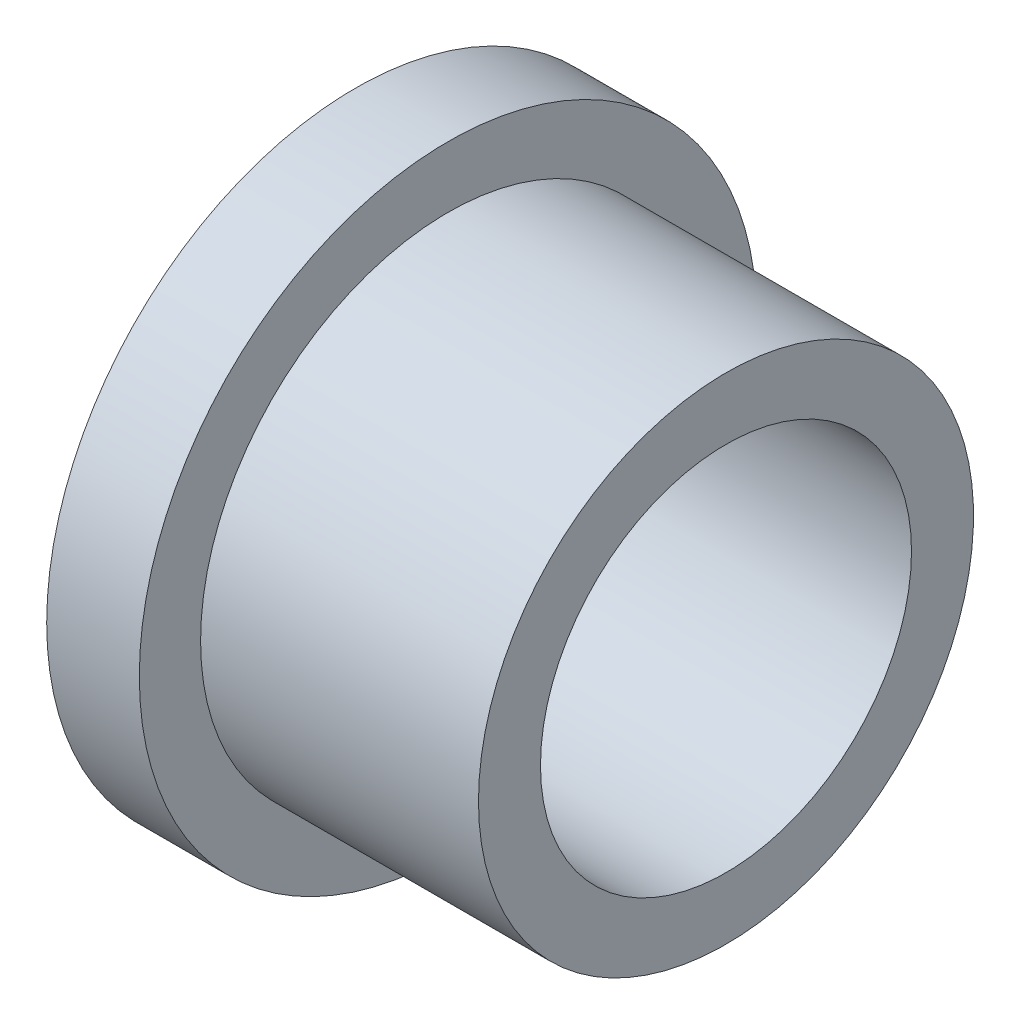
ISO-10303-21;
HEADER;
FILE_DESCRIPTION(('STEP AP214'),'2;1');
FILE_NAME('part.step','',(''),(''),'','','');
FILE_SCHEMA(('AUTOMOTIVE_DESIGN { 1 0 10303 214 1 1 1 1 }'));
ENDSEC;
DATA;
#1=APPLICATION_CONTEXT('core data for automotive mechanical design processes');
#2=APPLICATION_PROTOCOL_DEFINITION('international standard','automotive_design',2000,#1);
#3=PRODUCT_CONTEXT('',#1,'mechanical');
#4=PRODUCT('Part','Part','',(#3));
#5=PRODUCT_RELATED_PRODUCT_CATEGORY('part','',(#4));
#6=PRODUCT_DEFINITION_FORMATION('','',#4);
#7=PRODUCT_DEFINITION_CONTEXT('part definition',#1,'design');
#8=PRODUCT_DEFINITION('design','',#6,#7);
#9=PRODUCT_DEFINITION_SHAPE('','',#8);
#10=(LENGTH_UNIT() NAMED_UNIT(*) SI_UNIT(.MILLI.,.METRE.));
#11=(NAMED_UNIT(*) PLANE_ANGLE_UNIT() SI_UNIT($,.RADIAN.));
#12=(NAMED_UNIT(*) SI_UNIT($,.STERADIAN.) SOLID_ANGLE_UNIT());
#13=UNCERTAINTY_MEASURE_WITH_UNIT(LENGTH_MEASURE(1.E-05),#10,'distance_accuracy_value','');
#14=(GEOMETRIC_REPRESENTATION_CONTEXT(3) GLOBAL_UNCERTAINTY_ASSIGNED_CONTEXT((#13)) GLOBAL_UNIT_ASSIGNED_CONTEXT((#10,
#11,#12)) REPRESENTATION_CONTEXT('',''));
#15=CARTESIAN_POINT('',(0.,0.,0.));
#16=DIRECTION('',(0.,0.,1.));
#17=DIRECTION('',(1.,0.,0.));
#18=AXIS2_PLACEMENT_3D('',#15,#16,#17);
#19=CARTESIAN_POINT('',(4.7625,0.,0.));
#20=DIRECTION('',(1.,0.,0.));
#21=DIRECTION('',(0.,0.,-1.));
#22=AXIS2_PLACEMENT_3D('',#19,#20,#21);
#23=PLANE('',#22);
#24=CARTESIAN_POINT('',(4.7625,0.,0.));
#25=DIRECTION('',(1.,0.,0.));
#26=DIRECTION('',(0.,0.,-1.));
#27=AXIS2_PLACEMENT_3D('',#24,#25,#26);
#28=CIRCLE('',#27,15.875);
#29=CARTESIAN_POINT('',(4.7625,0.,15.875));
#30=VERTEX_POINT('',#29);
#31=EDGE_CURVE('E11',#30,#30,#28,.T.);
#32=ORIENTED_EDGE('',*,*,#31,.T.);
#33=EDGE_LOOP('',(#32));
#34=FACE_BOUND('',#33,.T.);
#35=CARTESIAN_POINT('',(4.7625,0.,0.));
#36=DIRECTION('',(1.,0.,0.));
#37=DIRECTION('',(0.,0.,-1.));
#38=AXIS2_PLACEMENT_3D('',#35,#36,#37);
#39=CIRCLE('',#38,12.7254);
#40=CARTESIAN_POINT('',(4.7625,0.,12.7254));
#41=VERTEX_POINT('',#40);
#42=EDGE_CURVE('E66',#41,#41,#39,.F.);
#43=ORIENTED_EDGE('',*,*,#42,.T.);
#44=EDGE_LOOP('',(#43));
#45=FACE_BOUND('',#44,.T.);
#46=ADVANCED_FACE('F51',(#34,#45),#23,.T.);
#47=CARTESIAN_POINT('',(0.,0.,0.));
#48=DIRECTION('',(1.,0.,0.));
#49=DIRECTION('',(0.,0.,-1.));
#50=AXIS2_PLACEMENT_3D('',#47,#48,#49);
#51=PLANE('',#50);
#52=CARTESIAN_POINT('',(0.,0.,0.));
#53=DIRECTION('',(1.,0.,0.));
#54=DIRECTION('',(0.,0.,-1.));
#55=AXIS2_PLACEMENT_3D('',#52,#53,#54);
#56=CIRCLE('',#55,9.5377);
#57=CARTESIAN_POINT('',(0.,0.,9.5377));
#58=VERTEX_POINT('',#57);
#59=EDGE_CURVE('E62',#58,#58,#56,.T.);
#60=ORIENTED_EDGE('',*,*,#59,.T.);
#61=EDGE_LOOP('',(#60));
#62=FACE_BOUND('',#61,.T.);
#63=CARTESIAN_POINT('',(0.,0.,0.));
#64=DIRECTION('',(1.,0.,0.));
#65=DIRECTION('',(0.,0.,-1.));
#66=AXIS2_PLACEMENT_3D('',#63,#64,#65);
#67=CIRCLE('',#66,15.875);
#68=CARTESIAN_POINT('',(0.,0.,15.875));
#69=VERTEX_POINT('',#68);
#70=EDGE_CURVE('E55',#69,#69,#67,.T.);
#71=ORIENTED_EDGE('',*,*,#70,.F.);
#72=EDGE_LOOP('',(#71));
#73=FACE_BOUND('',#72,.T.);
#74=ADVANCED_FACE('F92',(#62,#73),#51,.F.);
#75=CARTESIAN_POINT('',(4.7625,0.,0.));
#76=DIRECTION('',(-1.,0.,0.));
#77=DIRECTION('',(0.,0.,1.));
#78=AXIS2_PLACEMENT_3D('',#75,#76,#77);
#79=CYLINDRICAL_SURFACE('',#78,15.875);
#80=CARTESIAN_POINT('',(4.7625,0.,15.875));
#81=CARTESIAN_POINT('',(4.712890625,0.,15.875));
#82=CARTESIAN_POINT('',(4.66328125,0.,15.875));
#83=CARTESIAN_POINT('',(4.5640625,0.,15.875));
#84=CARTESIAN_POINT('',(4.514453125,0.,15.875));
#85=CARTESIAN_POINT('',(4.415234375,0.,15.875));
#86=CARTESIAN_POINT('',(4.365625,0.,15.875));
#87=CARTESIAN_POINT('',(4.26640625,0.,15.875));
#88=CARTESIAN_POINT('',(4.216796875,0.,15.875));
#89=CARTESIAN_POINT('',(4.117578125,0.,15.875));
#90=CARTESIAN_POINT('',(4.06796875,0.,15.875));
#91=CARTESIAN_POINT('',(3.96875,0.,15.875));
#92=CARTESIAN_POINT('',(3.919140625,0.,15.875));
#93=CARTESIAN_POINT('',(3.819921875,0.,15.875));
#94=CARTESIAN_POINT('',(3.7703125,0.,15.875));
#95=CARTESIAN_POINT('',(3.67109375,0.,15.875));
#96=CARTESIAN_POINT('',(3.621484375,0.,15.875));
#97=CARTESIAN_POINT('',(3.522265625,0.,15.875));
#98=CARTESIAN_POINT('',(3.47265625,0.,15.875));
#99=CARTESIAN_POINT('',(3.3734375,0.,15.875));
#100=CARTESIAN_POINT('',(3.323828125,0.,15.875));
#101=CARTESIAN_POINT('',(3.224609375,0.,15.875));
#102=CARTESIAN_POINT('',(3.175,0.,15.875));
#103=CARTESIAN_POINT('',(3.07578125,0.,15.875));
#104=CARTESIAN_POINT('',(3.026171875,0.,15.875));
#105=CARTESIAN_POINT('',(2.926953125,0.,15.875));
#106=CARTESIAN_POINT('',(2.87734375,0.,15.875));
#107=CARTESIAN_POINT('',(2.778125,0.,15.875));
#108=CARTESIAN_POINT('',(2.728515625,0.,15.875));
#109=CARTESIAN_POINT('',(2.629296875,0.,15.875));
#110=CARTESIAN_POINT('',(2.5796875,0.,15.875));
#111=CARTESIAN_POINT('',(2.48046875,0.,15.875));
#112=CARTESIAN_POINT('',(2.430859375,0.,15.875));
#113=CARTESIAN_POINT('',(2.331640625,0.,15.875));
#114=CARTESIAN_POINT('',(2.28203125,0.,15.875));
#115=CARTESIAN_POINT('',(2.1828125,0.,15.875));
#116=CARTESIAN_POINT('',(2.133203125,0.,15.875));
#117=CARTESIAN_POINT('',(2.033984375,0.,15.875));
#118=CARTESIAN_POINT('',(1.984375,0.,15.875));
#119=CARTESIAN_POINT('',(1.88515625,0.,15.875));
#120=CARTESIAN_POINT('',(1.835546875,0.,15.875));
#121=CARTESIAN_POINT('',(1.736328125,0.,15.875));
#122=CARTESIAN_POINT('',(1.68671875,0.,15.875));
#123=CARTESIAN_POINT('',(1.5875,0.,15.875));
#124=CARTESIAN_POINT('',(1.537890625,0.,15.875));
#125=CARTESIAN_POINT('',(1.438671875,0.,15.875));
#126=CARTESIAN_POINT('',(1.3890625,0.,15.875));
#127=CARTESIAN_POINT('',(1.28984375,0.,15.875));
#128=CARTESIAN_POINT('',(1.240234375,0.,15.875));
#129=CARTESIAN_POINT('',(1.141015625,0.,15.875));
#130=CARTESIAN_POINT('',(1.09140625,0.,15.875));
#131=CARTESIAN_POINT('',(0.992187499999999,0.,15.875));
#132=CARTESIAN_POINT('',(0.942578124999999,0.,15.875));
#133=CARTESIAN_POINT('',(0.843359375,0.,15.875));
#134=CARTESIAN_POINT('',(0.79375,0.,15.875));
#135=CARTESIAN_POINT('',(0.69453125,0.,15.875));
#136=CARTESIAN_POINT('',(0.644921875,0.,15.875));
#137=CARTESIAN_POINT('',(0.545703125,0.,15.875));
#138=CARTESIAN_POINT('',(0.49609375,0.,15.875));
#139=CARTESIAN_POINT('',(0.396875,0.,15.875));
#140=CARTESIAN_POINT('',(0.347265625,0.,15.875));
#141=CARTESIAN_POINT('',(0.248046875,0.,15.875));
#142=CARTESIAN_POINT('',(0.1984375,0.,15.875));
#143=CARTESIAN_POINT('',(0.09921875,0.,15.875));
#144=CARTESIAN_POINT('',(0.049609375,0.,15.875));
#145=CARTESIAN_POINT('',(0.,0.,15.875));
#146=B_SPLINE_CURVE_WITH_KNOTS('',3,(#80,#81,#82,#83,#84,#85,#86,#87,#88,#89,#90,#91,#92,#93,
#94,#95,#96,#97,#98,#99,#100,#101,#102,#103,#104,#105,#106,#107,#108,#109,#110,#111,#112,#113,
#114,#115,#116,#117,#118,#119,#120,#121,#122,#123,#124,#125,#126,#127,#128,#129,#130,#131,#132,
#133,#134,#135,#136,#137,#138,#139,#140,#141,#142,#143,#144,#145),.UNSPECIFIED.,.F.,.F.,(4,2,2,
2,2,2,2,2,2,2,2,2,2,2,2,2,2,2,2,2,2,2,2,2,2,2,2,2,2,2,2,2,4),(0.,0.148828125,0.29765625,
0.446484375,0.5953125,0.744140625,0.892968750000001,1.041796875,1.190625,1.339453125,1.48828125,
1.637109375,1.7859375,1.934765625,2.08359375,2.232421875,2.38125,2.530078125,2.67890625,
2.827734375,2.9765625,3.125390625,3.27421875,3.423046875,3.571875,3.720703125,3.86953125,
4.018359375,4.1671875,4.316015625,4.46484375,4.613671875,4.7625),.UNSPECIFIED.);
#147=EDGE_CURVE('BSEAM53',#30,#69,#146,.T.);
#148=ORIENTED_EDGE('',*,*,#31,.F.);
#149=ORIENTED_EDGE('',*,*,#70,.T.);
#150=ORIENTED_EDGE('',*,*,#147,.T.);
#151=ORIENTED_EDGE('',*,*,#147,.F.);
#152=EDGE_LOOP('',(#148,#150,#149,#151));
#153=FACE_BOUND('',#152,.T.);
#154=ADVANCED_FACE('F53',(#153),#79,.T.);
#155=CARTESIAN_POINT('',(4.7625,0.,0.));
#156=DIRECTION('',(-1.,0.,0.));
#157=DIRECTION('',(0.,0.,1.));
#158=AXIS2_PLACEMENT_3D('',#155,#156,#157);
#159=CYLINDRICAL_SURFACE('',#158,9.5377);
#160=CARTESIAN_POINT('',(19.05,0.,0.));
#161=DIRECTION('',(1.,0.,0.));
#162=DIRECTION('',(0.,0.,-1.));
#163=AXIS2_PLACEMENT_3D('',#160,#161,#162);
#164=CIRCLE('',#163,9.5377);
#165=CARTESIAN_POINT('',(19.05,0.,9.5377));
#166=VERTEX_POINT('',#165);
#167=EDGE_CURVE('E72',#166,#166,#164,.T.);
#168=CARTESIAN_POINT('',(0.,0.,9.5377));
#169=CARTESIAN_POINT('',(0.1984375,0.,9.5377));
#170=CARTESIAN_POINT('',(0.396875,0.,9.5377));
#171=CARTESIAN_POINT('',(0.79375,0.,9.5377));
#172=CARTESIAN_POINT('',(0.9921875,0.,9.5377));
#173=CARTESIAN_POINT('',(1.3890625,0.,9.5377));
#174=CARTESIAN_POINT('',(1.5875,0.,9.5377));
#175=CARTESIAN_POINT('',(1.984375,0.,9.5377));
#176=CARTESIAN_POINT('',(2.1828125,0.,9.5377));
#177=CARTESIAN_POINT('',(2.5796875,0.,9.5377));
#178=CARTESIAN_POINT('',(2.778125,0.,9.5377));
#179=CARTESIAN_POINT('',(3.175,0.,9.5377));
#180=CARTESIAN_POINT('',(3.3734375,0.,9.5377));
#181=CARTESIAN_POINT('',(3.7703125,0.,9.5377));
#182=CARTESIAN_POINT('',(3.96875,0.,9.5377));
#183=CARTESIAN_POINT('',(4.365625,0.,9.5377));
#184=CARTESIAN_POINT('',(4.5640625,0.,9.5377));
#185=CARTESIAN_POINT('',(4.9609375,0.,9.5377));
#186=CARTESIAN_POINT('',(5.159375,0.,9.5377));
#187=CARTESIAN_POINT('',(5.55625,0.,9.5377));
#188=CARTESIAN_POINT('',(5.7546875,0.,9.5377));
#189=CARTESIAN_POINT('',(6.1515625,0.,9.5377));
#190=CARTESIAN_POINT('',(6.35,0.,9.5377));
#191=CARTESIAN_POINT('',(6.746875,0.,9.5377));
#192=CARTESIAN_POINT('',(6.9453125,0.,9.5377));
#193=CARTESIAN_POINT('',(7.3421875,0.,9.5377));
#194=CARTESIAN_POINT('',(7.540625,0.,9.5377));
#195=CARTESIAN_POINT('',(7.9375,0.,9.5377));
#196=CARTESIAN_POINT('',(8.1359375,0.,9.5377));
#197=CARTESIAN_POINT('',(8.5328125,0.,9.5377));
#198=CARTESIAN_POINT('',(8.73125,0.,9.5377));
#199=CARTESIAN_POINT('',(9.128125,0.,9.5377));
#200=CARTESIAN_POINT('',(9.3265625,0.,9.5377));
#201=CARTESIAN_POINT('',(9.7234375,0.,9.5377));
#202=CARTESIAN_POINT('',(9.921875,0.,9.5377));
#203=CARTESIAN_POINT('',(10.31875,0.,9.5377));
#204=CARTESIAN_POINT('',(10.5171875,0.,9.5377));
#205=CARTESIAN_POINT('',(10.9140625,0.,9.5377));
#206=CARTESIAN_POINT('',(11.1125,0.,9.5377));
#207=CARTESIAN_POINT('',(11.509375,0.,9.5377));
#208=CARTESIAN_POINT('',(11.7078125,0.,9.5377));
#209=CARTESIAN_POINT('',(12.1046875,0.,9.5377));
#210=CARTESIAN_POINT('',(12.303125,0.,9.5377));
#211=CARTESIAN_POINT('',(12.7,0.,9.5377));
#212=CARTESIAN_POINT('',(12.8984375,0.,9.5377));
#213=CARTESIAN_POINT('',(13.2953125,0.,9.5377));
#214=CARTESIAN_POINT('',(13.49375,0.,9.5377));
#215=CARTESIAN_POINT('',(13.890625,0.,9.5377));
#216=CARTESIAN_POINT('',(14.0890625,0.,9.5377));
#217=CARTESIAN_POINT('',(14.4859375,0.,9.5377));
#218=CARTESIAN_POINT('',(14.684375,0.,9.5377));
#219=CARTESIAN_POINT('',(15.08125,0.,9.5377));
#220=CARTESIAN_POINT('',(15.2796875,0.,9.5377));
#221=CARTESIAN_POINT('',(15.6765625,0.,9.5377));
#222=CARTESIAN_POINT('',(15.875,0.,9.5377));
#223=CARTESIAN_POINT('',(16.271875,0.,9.5377));
#224=CARTESIAN_POINT('',(16.4703125,0.,9.5377));
#225=CARTESIAN_POINT('',(16.8671875,0.,9.5377));
#226=CARTESIAN_POINT('',(17.065625,0.,9.5377));
#227=CARTESIAN_POINT('',(17.4625,0.,9.5377));
#228=CARTESIAN_POINT('',(17.6609375,0.,9.5377));
#229=CARTESIAN_POINT('',(18.0578125,0.,9.5377));
#230=CARTESIAN_POINT('',(18.25625,0.,9.5377));
#231=CARTESIAN_POINT('',(18.653125,0.,9.5377));
#232=CARTESIAN_POINT('',(18.8515625,0.,9.5377));
#233=CARTESIAN_POINT('',(19.05,0.,9.5377));
#234=B_SPLINE_CURVE_WITH_KNOTS('',3,(#168,#169,#170,#171,#172,#173,#174,#175,#176,#177,#178,
#179,#180,#181,#182,#183,#184,#185,#186,#187,#188,#189,#190,#191,#192,#193,#194,#195,#196,#197,
#198,#199,#200,#201,#202,#203,#204,#205,#206,#207,#208,#209,#210,#211,#212,#213,#214,#215,#216,
#217,#218,#219,#220,#221,#222,#223,#224,#225,#226,#227,#228,#229,#230,#231,#232,#233),
.UNSPECIFIED.,.F.,.F.,(4,2,2,2,2,2,2,2,2,2,2,2,2,2,2,2,2,2,2,2,2,2,2,2,2,2,2,2,2,2,2,2,4),(0.,
0.5953125,1.190625,1.7859375,2.38125,2.9765625,3.571875,4.1671875,4.7625,5.3578125,5.953125,
6.5484375,7.14375,7.7390625,8.334375,8.9296875,9.525,10.1203125,10.715625,11.3109375,11.90625,
12.5015625,13.096875,13.6921875,14.2875,14.8828125,15.478125,16.0734375,16.66875,17.2640625,
17.859375,18.4546875,19.05),.UNSPECIFIED.);
#235=EDGE_CURVE('BSEAM76',#58,#166,#234,.T.);
#236=ORIENTED_EDGE('',*,*,#59,.F.);
#237=ORIENTED_EDGE('',*,*,#167,.T.);
#238=ORIENTED_EDGE('',*,*,#235,.T.);
#239=ORIENTED_EDGE('',*,*,#235,.F.);
#240=EDGE_LOOP('',(#236,#238,#237,#239));
#241=FACE_BOUND('',#240,.T.);
#242=ADVANCED_FACE('F76',(#241),#159,.F.);
#243=CARTESIAN_POINT('',(19.05,0.,0.));
#244=DIRECTION('',(1.,0.,0.));
#245=DIRECTION('',(0.,0.,-1.));
#246=AXIS2_PLACEMENT_3D('',#243,#244,#245);
#247=PLANE('',#246);
#248=CARTESIAN_POINT('',(19.05,0.,0.));
#249=DIRECTION('',(1.,0.,0.));
#250=DIRECTION('',(0.,0.,-1.));
#251=AXIS2_PLACEMENT_3D('',#248,#249,#250);
#252=CIRCLE('',#251,12.7254);
#253=CARTESIAN_POINT('',(19.05,0.,12.7254));
#254=VERTEX_POINT('',#253);
#255=EDGE_CURVE('E69',#254,#254,#252,.T.);
#256=ORIENTED_EDGE('',*,*,#255,.T.);
#257=EDGE_LOOP('',(#256));
#258=FACE_BOUND('',#257,.T.);
#259=ORIENTED_EDGE('',*,*,#167,.F.);
#260=EDGE_LOOP('',(#259));
#261=FACE_BOUND('',#260,.T.);
#262=ADVANCED_FACE('F78',(#258,#261),#247,.T.);
#263=CARTESIAN_POINT('',(19.05,0.,0.));
#264=DIRECTION('',(-1.,0.,0.));
#265=DIRECTION('',(0.,0.,1.));
#266=AXIS2_PLACEMENT_3D('',#263,#264,#265);
#267=CYLINDRICAL_SURFACE('',#266,12.7254);
#268=CARTESIAN_POINT('',(4.7625,0.,12.7254));
#269=CARTESIAN_POINT('',(4.911328125,0.,12.7254));
#270=CARTESIAN_POINT('',(5.06015625,0.,12.7254));
#271=CARTESIAN_POINT('',(5.3578125,0.,12.7254));
#272=CARTESIAN_POINT('',(5.506640625,0.,12.7254));
#273=CARTESIAN_POINT('',(5.804296875,0.,12.7254));
#274=CARTESIAN_POINT('',(5.953125,0.,12.7254));
#275=CARTESIAN_POINT('',(6.25078125,0.,12.7254));
#276=CARTESIAN_POINT('',(6.399609375,0.,12.7254));
#277=CARTESIAN_POINT('',(6.697265625,0.,12.7254));
#278=CARTESIAN_POINT('',(6.84609375,0.,12.7254));
#279=CARTESIAN_POINT('',(7.14375,0.,12.7254));
#280=CARTESIAN_POINT('',(7.292578125,0.,12.7254));
#281=CARTESIAN_POINT('',(7.590234375,0.,12.7254));
#282=CARTESIAN_POINT('',(7.7390625,0.,12.7254));
#283=CARTESIAN_POINT('',(8.03671875,0.,12.7254));
#284=CARTESIAN_POINT('',(8.185546875,0.,12.7254));
#285=CARTESIAN_POINT('',(8.483203125,0.,12.7254));
#286=CARTESIAN_POINT('',(8.63203125,0.,12.7254));
#287=CARTESIAN_POINT('',(8.9296875,0.,12.7254));
#288=CARTESIAN_POINT('',(9.078515625,0.,12.7254));
#289=CARTESIAN_POINT('',(9.376171875,0.,12.7254));
#290=CARTESIAN_POINT('',(9.525,0.,12.7254));
#291=CARTESIAN_POINT('',(9.82265625,0.,12.7254));
#292=CARTESIAN_POINT('',(9.971484375,0.,12.7254));
#293=CARTESIAN_POINT('',(10.269140625,0.,12.7254));
#294=CARTESIAN_POINT('',(10.41796875,0.,12.7254));
#295=CARTESIAN_POINT('',(10.715625,0.,12.7254));
#296=CARTESIAN_POINT('',(10.864453125,0.,12.7254));
#297=CARTESIAN_POINT('',(11.162109375,0.,12.7254));
#298=CARTESIAN_POINT('',(11.3109375,0.,12.7254));
#299=CARTESIAN_POINT('',(11.60859375,0.,12.7254));
#300=CARTESIAN_POINT('',(11.757421875,0.,12.7254));
#301=CARTESIAN_POINT('',(12.055078125,0.,12.7254));
#302=CARTESIAN_POINT('',(12.20390625,0.,12.7254));
#303=CARTESIAN_POINT('',(12.5015625,0.,12.7254));
#304=CARTESIAN_POINT('',(12.650390625,0.,12.7254));
#305=CARTESIAN_POINT('',(12.948046875,0.,12.7254));
#306=CARTESIAN_POINT('',(13.096875,0.,12.7254));
#307=CARTESIAN_POINT('',(13.39453125,0.,12.7254));
#308=CARTESIAN_POINT('',(13.543359375,0.,12.7254));
#309=CARTESIAN_POINT('',(13.841015625,0.,12.7254));
#310=CARTESIAN_POINT('',(13.98984375,0.,12.7254));
#311=CARTESIAN_POINT('',(14.2875,0.,12.7254));
#312=CARTESIAN_POINT('',(14.436328125,0.,12.7254));
#313=CARTESIAN_POINT('',(14.733984375,0.,12.7254));
#314=CARTESIAN_POINT('',(14.8828125,0.,12.7254));
#315=CARTESIAN_POINT('',(15.18046875,0.,12.7254));
#316=CARTESIAN_POINT('',(15.329296875,0.,12.7254));
#317=CARTESIAN_POINT('',(15.626953125,0.,12.7254));
#318=CARTESIAN_POINT('',(15.77578125,0.,12.7254));
#319=CARTESIAN_POINT('',(16.0734375,0.,12.7254));
#320=CARTESIAN_POINT('',(16.222265625,0.,12.7254));
#321=CARTESIAN_POINT('',(16.519921875,0.,12.7254));
#322=CARTESIAN_POINT('',(16.66875,0.,12.7254));
#323=CARTESIAN_POINT('',(16.96640625,0.,12.7254));
#324=CARTESIAN_POINT('',(17.115234375,0.,12.7254));
#325=CARTESIAN_POINT('',(17.412890625,0.,12.7254));
#326=CARTESIAN_POINT('',(17.56171875,0.,12.7254));
#327=CARTESIAN_POINT('',(17.859375,0.,12.7254));
#328=CARTESIAN_POINT('',(18.008203125,0.,12.7254));
#329=CARTESIAN_POINT('',(18.305859375,0.,12.7254));
#330=CARTESIAN_POINT('',(18.4546875,0.,12.7254));
#331=CARTESIAN_POINT('',(18.75234375,0.,12.7254));
#332=CARTESIAN_POINT('',(18.901171875,0.,12.7254));
#333=CARTESIAN_POINT('',(19.05,0.,12.7254));
#334=B_SPLINE_CURVE_WITH_KNOTS('',3,(#268,#269,#270,#271,#272,#273,#274,#275,#276,#277,#278,
#279,#280,#281,#282,#283,#284,#285,#286,#287,#288,#289,#290,#291,#292,#293,#294,#295,#296,#297,
#298,#299,#300,#301,#302,#303,#304,#305,#306,#307,#308,#309,#310,#311,#312,#313,#314,#315,#316,
#317,#318,#319,#320,#321,#322,#323,#324,#325,#326,#327,#328,#329,#330,#331,#332,#333),
.UNSPECIFIED.,.F.,.F.,(4,2,2,2,2,2,2,2,2,2,2,2,2,2,2,2,2,2,2,2,2,2,2,2,2,2,2,2,2,2,2,2,4),(0.,
0.446484375,0.892968750000001,1.339453125,1.7859375,2.232421875,2.67890625,3.125390625,3.571875,
4.018359375,4.46484375,4.911328125,5.3578125,5.804296875,6.25078125,6.697265625,7.14375,
7.590234375,8.03671875,8.483203125,8.9296875,9.376171875,9.82265625,10.269140625,10.715625,
11.162109375,11.60859375,12.055078125,12.5015625,12.948046875,13.39453125,13.841015625,14.2875),.UNSPECIFIED.);
#335=EDGE_CURVE('BSEAM80',#41,#254,#334,.T.);
#336=ORIENTED_EDGE('',*,*,#42,.F.);
#337=ORIENTED_EDGE('',*,*,#255,.F.);
#338=ORIENTED_EDGE('',*,*,#335,.T.);
#339=ORIENTED_EDGE('',*,*,#335,.F.);
#340=EDGE_LOOP('',(#336,#338,#337,#339));
#341=FACE_BOUND('',#340,.T.);
#342=ADVANCED_FACE('F80',(#341),#267,.T.);
#343=CLOSED_SHELL('',(#46,#74,#154,#242,#262,#342));
#344=MANIFOLD_SOLID_BREP('B2',#343);
#345=ADVANCED_BREP_SHAPE_REPRESENTATION('',(#18,#344),#14);
#346=SHAPE_DEFINITION_REPRESENTATION(#9,#345);
ENDSEC;
END-ISO-10303-21;
